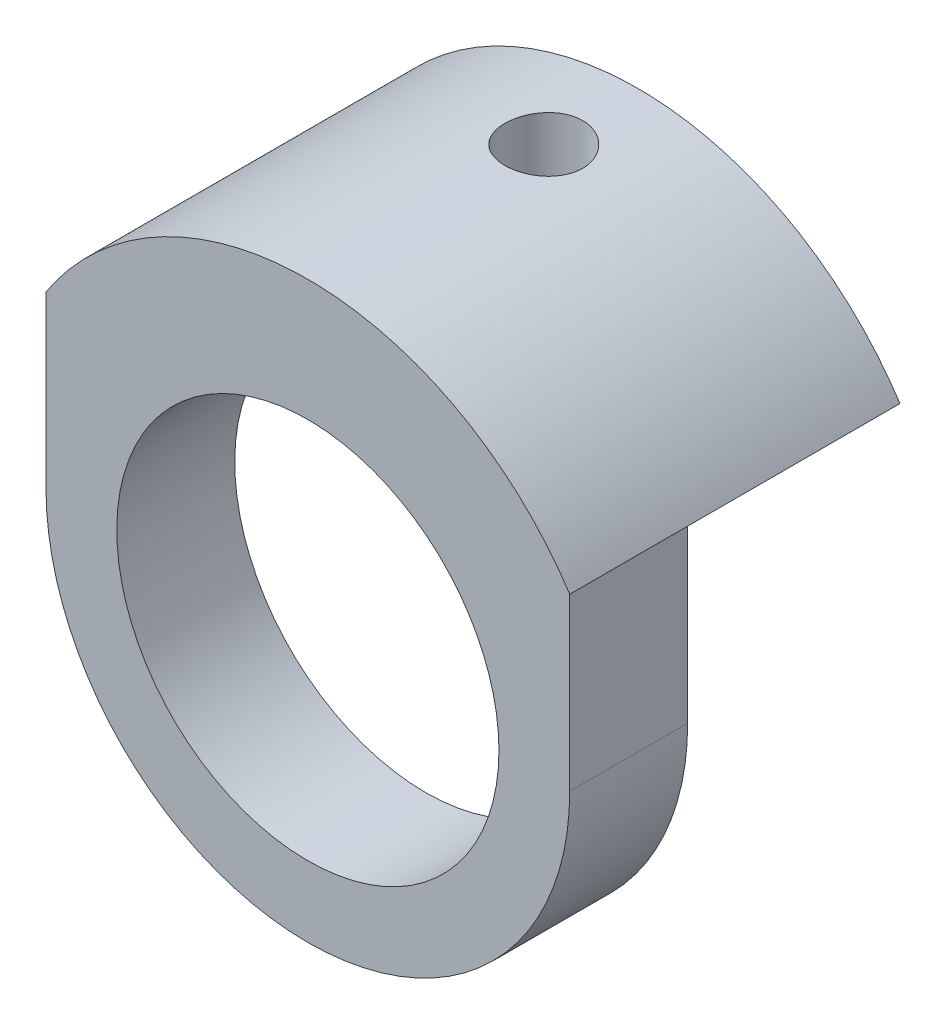
ISO-10303-21;
HEADER;
FILE_DESCRIPTION(('STEP AP214'),'2;1');
FILE_NAME('part.step','',(''),(''),'','','');
FILE_SCHEMA(('AUTOMOTIVE_DESIGN { 1 0 10303 214 1 1 1 1 }'));
ENDSEC;
DATA;
#1=APPLICATION_CONTEXT('core data for automotive mechanical design processes');
#2=APPLICATION_PROTOCOL_DEFINITION('international standard','automotive_design',2000,#1);
#3=PRODUCT_CONTEXT('',#1,'mechanical');
#4=PRODUCT('Part','Part','',(#3));
#5=PRODUCT_RELATED_PRODUCT_CATEGORY('part','',(#4));
#6=PRODUCT_DEFINITION_FORMATION('','',#4);
#7=PRODUCT_DEFINITION_CONTEXT('part definition',#1,'design');
#8=PRODUCT_DEFINITION('design','',#6,#7);
#9=PRODUCT_DEFINITION_SHAPE('','',#8);
#10=(LENGTH_UNIT() NAMED_UNIT(*) SI_UNIT(.MILLI.,.METRE.));
#11=(NAMED_UNIT(*) PLANE_ANGLE_UNIT() SI_UNIT($,.RADIAN.));
#12=(NAMED_UNIT(*) SI_UNIT($,.STERADIAN.) SOLID_ANGLE_UNIT());
#13=UNCERTAINTY_MEASURE_WITH_UNIT(LENGTH_MEASURE(1.E-05),#10,'distance_accuracy_value','');
#14=(GEOMETRIC_REPRESENTATION_CONTEXT(3) GLOBAL_UNCERTAINTY_ASSIGNED_CONTEXT((#13)) GLOBAL_UNIT_ASSIGNED_CONTEXT((#10,
#11,#12)) REPRESENTATION_CONTEXT('',''));
#15=CARTESIAN_POINT('',(0.,0.,0.));
#16=DIRECTION('',(0.,0.,1.));
#17=DIRECTION('',(1.,0.,0.));
#18=AXIS2_PLACEMENT_3D('',#15,#16,#17);
#19=CARTESIAN_POINT('',(0.,13.251,4.));
#20=DIRECTION('',(0.,-1.,0.));
#21=DIRECTION('',(1.,0.,0.));
#22=AXIS2_PLACEMENT_3D('',#19,#20,#21);
#23=CYLINDRICAL_SURFACE('',#22,1.65);
#24=CARTESIAN_POINT('',(1.65,13.1468627436358,4.));
#25=CARTESIAN_POINT('',(1.64999607435799,13.1468640650512,3.90770511397931));
#26=CARTESIAN_POINT('',(1.6422299195592,13.1478451438771,3.81535247378816));
#27=CARTESIAN_POINT('',(1.61137186955299,13.1516619895794,3.63321718129561));
#28=CARTESIAN_POINT('',(1.58826394124934,13.1544996967012,3.54343732020779));
#29=CARTESIAN_POINT('',(1.52741396738131,13.1617035092574,3.36911099002338));
#30=CARTESIAN_POINT('',(1.48968183191,13.16606857948,3.28456102178633));
#31=CARTESIAN_POINT('',(1.40067568217671,13.1758340367914,3.1230089356762));
#32=CARTESIAN_POINT('',(1.34940399073085,13.1812342462505,3.04600552623623));
#33=CARTESIAN_POINT('',(1.23446901262629,13.1924951124963,2.90128881872499));
#34=CARTESIAN_POINT('',(1.17074551032243,13.1983579207512,2.83362350644956));
#35=CARTESIAN_POINT('',(1.03284538397164,13.2098640409056,2.70991823609294));
#36=CARTESIAN_POINT('',(0.958668241082194,13.2155073418925,2.65387885537973));
#37=CARTESIAN_POINT('',(0.801665028730647,13.2259605973692,2.55484422047103));
#38=CARTESIAN_POINT('',(0.718811377428216,13.2307677565552,2.51189237261777));
#39=CARTESIAN_POINT('',(0.546997062063094,13.238983451133,2.44053006568299));
#40=CARTESIAN_POINT('',(0.458036623161723,13.2423920380587,2.4121190707968));
#41=CARTESIAN_POINT('',(0.277024619016617,13.2474113820262,2.37078826585331));
#42=CARTESIAN_POINT('',(0.184991525871498,13.2490313924342,2.35778869729456));
#43=CARTESIAN_POINT('',(3.68047326695237E-05,13.2503226471851,2.34740258034791));
#44=CARTESIAN_POINT('',(-0.0928847884134744,13.2499939676464,2.35001542211818));
#45=CARTESIAN_POINT('',(-0.276436179408862,13.2474323647979,2.37071601941107));
#46=CARTESIAN_POINT('',(-0.367075819209221,13.2452099970323,2.38871799666264));
#47=CARTESIAN_POINT('',(-0.54403743451124,13.2391225911245,2.43955177538381));
#48=CARTESIAN_POINT('',(-0.630359328419617,13.2352575219531,2.47238385698327));
#49=CARTESIAN_POINT('',(-0.796500742017656,13.226300830311,2.55203714028923));
#50=CARTESIAN_POINT('',(-0.876302274026038,13.2212059585983,2.59889548063553));
#51=CARTESIAN_POINT('',(-1.02694147117898,13.2103597016208,2.7052441286148));
#52=CARTESIAN_POINT('',(-1.09777872807075,13.2046082864783,2.76473501123131));
#53=CARTESIAN_POINT('',(-1.22898247318828,13.1930465836236,2.89514048417062));
#54=CARTESIAN_POINT('',(-1.28927467573931,13.1872361612017,2.96612982743988));
#55=CARTESIAN_POINT('',(-1.39709953623934,13.1762498298532,3.11726025053199));
#56=CARTESIAN_POINT('',(-1.44463215473402,13.1710739228887,3.19740135865222));
#57=CARTESIAN_POINT('',(-1.52559272769009,13.1619426941876,3.36462640626011));
#58=CARTESIAN_POINT('',(-1.55901475894807,13.1579878852183,3.45171324315707));
#59=CARTESIAN_POINT('',(-1.61073969410903,13.1517566350547,3.6303234093091));
#60=CARTESIAN_POINT('',(-1.62904332097041,13.1494801136056,3.72184652620074));
#61=CARTESIAN_POINT('',(-1.64991355176687,13.1468778434556,3.90607524167058));
#62=CARTESIAN_POINT('',(-1.65258468597965,13.1465391374459,3.99876882253803));
#63=CARTESIAN_POINT('',(-1.64238988675226,13.1478165797578,4.18328217323734));
#64=CARTESIAN_POINT('',(-1.62952428191931,13.1494326867343,4.27510196150882));
#65=CARTESIAN_POINT('',(-1.58870921193719,13.1544258366627,4.45494822167048));
#66=CARTESIAN_POINT('',(-1.56081033788897,13.157796972178,4.54298635307696));
#67=CARTESIAN_POINT('',(-1.49077274562441,13.1659155451461,4.71313493265466));
#68=CARTESIAN_POINT('',(-1.44863353067017,13.1706630306084,4.79524517392529));
#69=CARTESIAN_POINT('',(-1.35105432544892,13.18103042312,4.95168016534115));
#70=CARTESIAN_POINT('',(-1.29554577183661,13.1866547728599,5.02596184860754));
#71=CARTESIAN_POINT('',(-1.17290052421013,13.1981282068846,5.16419177239279));
#72=CARTESIAN_POINT('',(-1.10576338136759,13.2039772998371,5.2281396138724));
#73=CARTESIAN_POINT('',(-0.961310170116461,13.2152809597203,5.34425366842125));
#74=CARTESIAN_POINT('',(-0.883938682048181,13.2207331083226,5.39635120499879));
#75=CARTESIAN_POINT('',(-0.7214826767725,13.2305924211063,5.48681064627915));
#76=CARTESIAN_POINT('',(-0.636398314072024,13.2349996062145,5.52517282605715));
#77=CARTESIAN_POINT('',(-0.461160244382222,13.2422616815536,5.58695912399668));
#78=CARTESIAN_POINT('',(-0.371020722874638,13.2451206971071,5.61042297004472));
#79=CARTESIAN_POINT('',(-0.188043451286781,13.2489814248757,5.64187579379073));
#80=CARTESIAN_POINT('',(-0.095205822106026,13.2499832201812,5.64986546378929));
#81=CARTESIAN_POINT('',(0.0898616833820928,13.2500162480837,5.65013026764066));
#82=CARTESIAN_POINT('',(0.18209142371569,13.2490607617256,5.64251131306574));
#83=CARTESIAN_POINT('',(0.36394881870391,13.2453129816565,5.61199941109229));
#84=CARTESIAN_POINT('',(0.453576475073469,13.242520689156,5.5891064737605));
#85=CARTESIAN_POINT('',(0.627671893379549,13.2354116689791,5.52872962942634));
#86=CARTESIAN_POINT('',(0.712141423367617,13.2310954671329,5.49125075489577));
#87=CARTESIAN_POINT('',(0.873608853011816,13.2214166265186,5.40277689890748));
#88=CARTESIAN_POINT('',(0.950606666541092,13.2160539756904,5.35178176167239));
#89=CARTESIAN_POINT('',(1.09548610440228,13.2048374686287,5.23733096909175));
#90=CARTESIAN_POINT('',(1.1633052443145,13.1989806471307,5.17379650287248));
#91=CARTESIAN_POINT('',(1.2873609241998,13.187459721669,5.03623411467208));
#92=CARTESIAN_POINT('',(1.34359471613078,13.1817956636942,4.9622037100704));
#93=CARTESIAN_POINT('',(1.44306750417806,13.1712784220509,4.8054257245064));
#94=CARTESIAN_POINT('',(1.48625586556726,13.1664284296471,4.72264581856065));
#95=CARTESIAN_POINT('',(1.55805699764563,13.1581258730386,4.55099432728715));
#96=CARTESIAN_POINT('',(1.58668563327671,13.1546717886355,4.46212949274092));
#97=CARTESIAN_POINT('',(1.62169480569012,13.150391478048,4.31066987143917));
#98=CARTESIAN_POINT('',(1.6322940049525,13.1490747861617,4.24903071232529));
#99=CARTESIAN_POINT('',(1.6464479044481,13.1473099749323,4.12493652092024));
#100=CARTESIAN_POINT('',(1.65000265756848,13.1468618490683,4.06248149475784));
#101=CARTESIAN_POINT('',(1.65,13.1468627436358,4.));
#102=B_SPLINE_CURVE_WITH_KNOTS('',3,(#24,#25,#26,#27,#28,#29,#30,#31,#32,#33,#34,#35,#36,#37,
#38,#39,#40,#41,#42,#43,#44,#45,#46,#47,#48,#49,#50,#51,#52,#53,#54,#55,#56,#57,#58,#59,#60,#61,
#62,#63,#64,#65,#66,#67,#68,#69,#70,#71,#72,#73,#74,#75,#76,#77,#78,#79,#80,#81,#82,#83,#84,#85,
#86,#87,#88,#89,#90,#91,#92,#93,#94,#95,#96,#97,#98,#99,#100,#101),.UNSPECIFIED.,.T.,.F.,(4,2,2,
2,2,2,2,2,2,2,2,2,2,2,2,2,2,2,2,2,2,2,2,2,2,2,2,2,2,2,2,2,2,2,2,2,2,2,4),(0.,0.276656404162496,
0.553602387333798,0.830361025284306,1.10707221394927,1.38515623238741,1.66325405775312,
1.94226443200912,2.22126452448675,2.49881432004205,2.77635327419844,3.05235525227836,
3.32836244405236,3.60510700952187,3.88186417401463,4.16049866208137,4.43913401171284,
4.71788620813681,4.99662507392702,5.27349793894918,5.55036494812013,5.82630598982224,
6.10225665801612,6.37965382970264,6.65706171046748,6.93603847462928,7.21500965146826,
7.49323376472387,7.77144543019758,8.04777555735825,8.32410550239588,8.60034019187671,
8.87657806515064,9.15461083017709,9.43270946877897,9.71187404898365,9.99073378344408,
10.1780251512489,10.3653151129325),.UNSPECIFIED.);
#103=CARTESIAN_POINT('',(1.65,13.1468627436358,4.));
#104=VERTEX_POINT('',#103);
#105=EDGE_CURVE('E147',#104,#104,#102,.T.);
#106=ORIENTED_EDGE('',*,*,#105,.T.);
#107=EDGE_LOOP('',(#106));
#108=FACE_BOUND('',#107,.T.);
#109=CARTESIAN_POINT('',(0.,10.2355027468725,4.));
#110=DIRECTION('',(0.,-1.,0.));
#111=DIRECTION('',(0.,0.,-1.));
#112=AXIS2_PLACEMENT_3D('',#109,#110,#111);
#113=CIRCLE('',#112,1.65);
#114=CARTESIAN_POINT('',(0.,10.2355027468725,2.35));
#115=VERTEX_POINT('',#114);
#116=EDGE_CURVE('E144',#115,#115,#113,.F.);
#117=ORIENTED_EDGE('',*,*,#116,.F.);
#118=EDGE_LOOP('',(#117));
#119=FACE_BOUND('',#118,.T.);
#120=ADVANCED_FACE('F45',(#108,#119),#23,.F.);
#121=CARTESIAN_POINT('',(0.,0.,14.));
#122=DIRECTION('',(0.,0.,-1.));
#123=DIRECTION('',(-1.,0.,0.));
#124=AXIS2_PLACEMENT_3D('',#121,#122,#123);
#125=CYLINDRICAL_SURFACE('',#124,11.1);
#126=CARTESIAN_POINT('',(0.,0.,9.));
#127=DIRECTION('',(0.,0.,1.));
#128=DIRECTION('',(0.,-1.,0.));
#129=AXIS2_PLACEMENT_3D('',#126,#127,#128);
#130=CIRCLE('',#129,11.1);
#131=CARTESIAN_POINT('',(-11.1,0.,9.));
#132=VERTEX_POINT('',#131);
#133=CARTESIAN_POINT('',(11.1,0.,9.));
#134=VERTEX_POINT('',#133);
#135=EDGE_CURVE('E135',#132,#134,#130,.T.);
#136=ORIENTED_EDGE('',*,*,#135,.T.);
#137=DIRECTION('',(0.,0.,-1.));
#138=VECTOR('',#137,1.);
#139=CARTESIAN_POINT('',(11.1,0.,14.));
#140=LINE('',#139,#138);
#141=CARTESIAN_POINT('',(11.1,0.,14.));
#142=VERTEX_POINT('',#141);
#143=EDGE_CURVE('E120',#142,#134,#140,.T.);
#144=ORIENTED_EDGE('',*,*,#143,.F.);
#145=CARTESIAN_POINT('',(0.,0.,14.));
#146=DIRECTION('',(0.,0.,1.));
#147=DIRECTION('',(1.,0.,0.));
#148=AXIS2_PLACEMENT_3D('',#145,#146,#147);
#149=CIRCLE('',#148,11.1);
#150=CARTESIAN_POINT('',(-11.1,0.,14.));
#151=VERTEX_POINT('',#150);
#152=EDGE_CURVE('E106',#151,#142,#149,.T.);
#153=ORIENTED_EDGE('',*,*,#152,.F.);
#154=DIRECTION('',(0.,0.,-1.));
#155=VECTOR('',#154,1.);
#156=CARTESIAN_POINT('',(-11.1,0.,14.));
#157=LINE('',#156,#155);
#158=EDGE_CURVE('E68',#151,#132,#157,.T.);
#159=ORIENTED_EDGE('',*,*,#158,.T.);
#160=EDGE_LOOP('',(#136,#144,#153,#159));
#161=FACE_BOUND('',#160,.T.);
#162=ADVANCED_FACE('F247',(#161),#125,.T.);
#163=CARTESIAN_POINT('',(11.1,0.,14.));
#164=DIRECTION('',(-1.,0.,0.));
#165=DIRECTION('',(0.,-1.,0.));
#166=AXIS2_PLACEMENT_3D('',#163,#164,#165);
#167=PLANE('',#166);
#168=ORIENTED_EDGE('',*,*,#143,.T.);
#169=DIRECTION('',(0.,-1.,0.));
#170=VECTOR('',#169,1.);
#171=CARTESIAN_POINT('',(11.1,7.23550274687255,9.));
#172=LINE('',#171,#170);
#173=CARTESIAN_POINT('',(11.1,7.23550274687254,9.));
#174=VERTEX_POINT('',#173);
#175=EDGE_CURVE('E117',#174,#134,#172,.T.);
#176=ORIENTED_EDGE('',*,*,#175,.F.);
#177=DIRECTION('',(0.,0.,-1.));
#178=VECTOR('',#177,1.);
#179=CARTESIAN_POINT('',(11.1,7.23550274687253,14.));
#180=LINE('',#179,#178);
#181=CARTESIAN_POINT('',(11.1,7.23550274687253,14.));
#182=VERTEX_POINT('',#181);
#183=EDGE_CURVE('E113',#182,#174,#180,.T.);
#184=ORIENTED_EDGE('',*,*,#183,.F.);
#185=DIRECTION('',(0.,1.,0.));
#186=VECTOR('',#185,1.);
#187=CARTESIAN_POINT('',(11.1,0.,14.));
#188=LINE('',#187,#186);
#189=EDGE_CURVE('E99',#142,#182,#188,.T.);
#190=ORIENTED_EDGE('',*,*,#189,.F.);
#191=EDGE_LOOP('',(#168,#176,#184,#190));
#192=FACE_BOUND('',#191,.T.);
#193=ADVANCED_FACE('F114',(#192),#167,.F.);
#194=CARTESIAN_POINT('',(0.,0.,14.));
#195=DIRECTION('',(0.,0.,-1.));
#196=DIRECTION('',(-1.,0.,0.));
#197=AXIS2_PLACEMENT_3D('',#194,#195,#196);
#198=CYLINDRICAL_SURFACE('',#197,13.25);
#199=ORIENTED_EDGE('',*,*,#105,.F.);
#200=EDGE_LOOP('',(#199));
#201=FACE_BOUND('',#200,.T.);
#202=CARTESIAN_POINT('',(0.,0.,0.));
#203=DIRECTION('',(0.,0.,1.));
#204=DIRECTION('',(1.,0.,0.));
#205=AXIS2_PLACEMENT_3D('',#202,#203,#204);
#206=CIRCLE('',#205,13.25);
#207=CARTESIAN_POINT('',(11.1,7.23550274687254,0.));
#208=VERTEX_POINT('',#207);
#209=CARTESIAN_POINT('',(-11.1,7.23550274687253,0.));
#210=VERTEX_POINT('',#209);
#211=EDGE_CURVE('E134',#208,#210,#206,.T.);
#212=ORIENTED_EDGE('',*,*,#211,.T.);
#213=DIRECTION('',(0.,0.,-1.));
#214=VECTOR('',#213,1.);
#215=CARTESIAN_POINT('',(-11.1,7.23550274687253,0.));
#216=LINE('',#215,#214);
#217=CARTESIAN_POINT('',(-11.1,7.23550274687253,9.));
#218=VERTEX_POINT('',#217);
#219=EDGE_CURVE('E82',#218,#210,#216,.T.);
#220=ORIENTED_EDGE('',*,*,#219,.F.);
#221=DIRECTION('',(0.,0.,-1.));
#222=VECTOR('',#221,1.);
#223=CARTESIAN_POINT('',(-11.1,7.23550274687253,14.));
#224=LINE('',#223,#222);
#225=CARTESIAN_POINT('',(-11.1,7.23550274687253,14.));
#226=VERTEX_POINT('',#225);
#227=EDGE_CURVE('E121',#226,#218,#224,.T.);
#228=ORIENTED_EDGE('',*,*,#227,.F.);
#229=CARTESIAN_POINT('',(0.,0.,14.));
#230=DIRECTION('',(0.,0.,1.));
#231=DIRECTION('',(1.,0.,0.));
#232=AXIS2_PLACEMENT_3D('',#229,#230,#231);
#233=CIRCLE('',#232,13.25);
#234=EDGE_CURVE('E104',#182,#226,#233,.T.);
#235=ORIENTED_EDGE('',*,*,#234,.F.);
#236=ORIENTED_EDGE('',*,*,#183,.T.);
#237=DIRECTION('',(0.,0.,1.));
#238=VECTOR('',#237,1.);
#239=CARTESIAN_POINT('',(11.1,7.23550274687254,0.));
#240=LINE('',#239,#238);
#241=EDGE_CURVE('E265',#208,#174,#240,.T.);
#242=ORIENTED_EDGE('',*,*,#241,.F.);
#243=EDGE_LOOP('',(#212,#220,#228,#235,#236,#242));
#244=FACE_BOUND('',#243,.T.);
#245=ADVANCED_FACE('F124',(#201,#244),#198,.T.);
#246=CARTESIAN_POINT('',(0.,0.,14.));
#247=DIRECTION('',(0.,0.,-1.));
#248=DIRECTION('',(-1.,0.,0.));
#249=AXIS2_PLACEMENT_3D('',#246,#247,#248);
#250=CYLINDRICAL_SURFACE('',#249,8.1);
#251=CARTESIAN_POINT('',(0.,0.,9.59999999999999));
#252=DIRECTION('',(0.866025403784439,0.,0.5));
#253=DIRECTION('',(0.5,0.,-0.866025403784439));
#254=AXIS2_PLACEMENT_3D('',#251,#252,#253);
#255=ELLIPSE('',#254,16.2,8.1);
#256=CARTESIAN_POINT('',(3.2331615074619,7.42675344054633,4.));
#257=VERTEX_POINT('',#256);
#258=CARTESIAN_POINT('',(1.61658075373095,7.9370439501534,6.8));
#259=VERTEX_POINT('',#258);
#260=EDGE_CURVE('E11',#257,#259,#255,.T.);
#261=ORIENTED_EDGE('',*,*,#260,.F.);
#262=CARTESIAN_POINT('',(0.,0.,-1.6));
#263=DIRECTION('',(0.866025403784439,0.,-0.5));
#264=DIRECTION('',(-0.5,0.,-0.866025403784439));
#265=AXIS2_PLACEMENT_3D('',#262,#263,#264);
#266=ELLIPSE('',#265,16.2,8.1);
#267=CARTESIAN_POINT('',(1.61658075373095,7.9370439501534,1.2));
#268=VERTEX_POINT('',#267);
#269=EDGE_CURVE('E53',#268,#257,#266,.T.);
#270=ORIENTED_EDGE('',*,*,#269,.F.);
#271=CARTESIAN_POINT('',(0.,0.,1.2));
#272=DIRECTION('',(0.,0.,-1.));
#273=DIRECTION('',(-1.,0.,0.));
#274=AXIS2_PLACEMENT_3D('',#271,#272,#273);
#275=CIRCLE('',#274,8.1);
#276=CARTESIAN_POINT('',(-1.61658075373095,7.9370439501534,1.2));
#277=VERTEX_POINT('',#276);
#278=EDGE_CURVE('E156',#277,#268,#275,.T.);
#279=ORIENTED_EDGE('',*,*,#278,.F.);
#280=CARTESIAN_POINT('',(0.,0.,-1.6));
#281=DIRECTION('',(-0.866025403784439,0.,-0.5));
#282=DIRECTION('',(0.5,0.,-0.866025403784439));
#283=AXIS2_PLACEMENT_3D('',#280,#281,#282);
#284=ELLIPSE('',#283,16.2,8.1);
#285=CARTESIAN_POINT('',(-3.2331615074619,7.42675344054632,4.));
#286=VERTEX_POINT('',#285);
#287=EDGE_CURVE('E153',#286,#277,#284,.T.);
#288=ORIENTED_EDGE('',*,*,#287,.F.);
#289=CARTESIAN_POINT('',(0.,0.,9.60000000000001));
#290=DIRECTION('',(-0.866025403784439,0.,0.499999999999999));
#291=DIRECTION('',(-0.499999999999999,0.,-0.866025403784439));
#292=AXIS2_PLACEMENT_3D('',#289,#290,#291);
#293=ELLIPSE('',#292,16.2,8.1);
#294=CARTESIAN_POINT('',(-1.61658075373095,7.9370439501534,6.8));
#295=VERTEX_POINT('',#294);
#296=EDGE_CURVE('E150',#295,#286,#293,.T.);
#297=ORIENTED_EDGE('',*,*,#296,.F.);
#298=CARTESIAN_POINT('',(0.,0.,6.8));
#299=DIRECTION('',(0.,0.,1.));
#300=DIRECTION('',(1.,0.,0.));
#301=AXIS2_PLACEMENT_3D('',#298,#299,#300);
#302=CIRCLE('',#301,8.1);
#303=EDGE_CURVE('E143',#259,#295,#302,.T.);
#304=ORIENTED_EDGE('',*,*,#303,.F.);
#305=EDGE_LOOP('',(#261,#270,#279,#288,#297,#304));
#306=FACE_BOUND('',#305,.T.);
#307=DIRECTION('',(0.,0.,-1.));
#308=VECTOR('',#307,1.);
#309=CARTESIAN_POINT('',(3.6410850031275,7.23550274687254,14.));
#310=LINE('',#309,#308);
#311=CARTESIAN_POINT('',(3.6410850031275,7.23550274687254,9.));
#312=VERTEX_POINT('',#311);
#313=CARTESIAN_POINT('',(3.6410850031275,7.23550274687254,0.));
#314=VERTEX_POINT('',#313);
#315=EDGE_CURVE('E280',#312,#314,#310,.T.);
#316=ORIENTED_EDGE('',*,*,#315,.F.);
#317=CARTESIAN_POINT('',(0.,0.,9.));
#318=DIRECTION('',(0.,0.,1.));
#319=DIRECTION('',(0.,-1.,0.));
#320=AXIS2_PLACEMENT_3D('',#317,#318,#319);
#321=CIRCLE('',#320,8.1);
#322=CARTESIAN_POINT('',(-3.6410850031275,7.23550274687254,9.));
#323=VERTEX_POINT('',#322);
#324=EDGE_CURVE('E260',#323,#312,#321,.T.);
#325=ORIENTED_EDGE('',*,*,#324,.F.);
#326=DIRECTION('',(0.,0.,-1.));
#327=VECTOR('',#326,1.);
#328=CARTESIAN_POINT('',(-3.6410850031275,7.23550274687254,14.));
#329=LINE('',#328,#327);
#330=CARTESIAN_POINT('',(-3.6410850031275,7.23550274687254,0.));
#331=VERTEX_POINT('',#330);
#332=EDGE_CURVE('E90',#331,#323,#329,.F.);
#333=ORIENTED_EDGE('',*,*,#332,.F.);
#334=CARTESIAN_POINT('',(0.,0.,0.));
#335=DIRECTION('',(0.,0.,1.));
#336=DIRECTION('',(1.,0.,0.));
#337=AXIS2_PLACEMENT_3D('',#334,#335,#336);
#338=CIRCLE('',#337,8.1);
#339=EDGE_CURVE('E131',#314,#331,#338,.T.);
#340=ORIENTED_EDGE('',*,*,#339,.F.);
#341=EDGE_LOOP('',(#316,#325,#333,#340));
#342=FACE_BOUND('',#341,.T.);
#343=CARTESIAN_POINT('',(0.,0.,14.));
#344=DIRECTION('',(0.,0.,1.));
#345=DIRECTION('',(1.,0.,0.));
#346=AXIS2_PLACEMENT_3D('',#343,#344,#345);
#347=CIRCLE('',#346,8.1);
#348=CARTESIAN_POINT('',(8.1,0.,14.));
#349=VERTEX_POINT('',#348);
#350=EDGE_CURVE('E137',#349,#349,#347,.T.);
#351=ORIENTED_EDGE('',*,*,#350,.T.);
#352=EDGE_LOOP('',(#351));
#353=FACE_BOUND('',#352,.T.);
#354=ADVANCED_FACE('F47',(#306,#342,#353),#250,.F.);
#355=CARTESIAN_POINT('',(-11.1,0.,14.));
#356=DIRECTION('',(-1.,0.,0.));
#357=DIRECTION('',(0.,-1.,0.));
#358=AXIS2_PLACEMENT_3D('',#355,#356,#357);
#359=PLANE('',#358);
#360=DIRECTION('',(0.,1.,0.));
#361=VECTOR('',#360,1.);
#362=CARTESIAN_POINT('',(-11.1,7.23550274687253,9.));
#363=LINE('',#362,#361);
#364=EDGE_CURVE('E218',#132,#218,#363,.T.);
#365=ORIENTED_EDGE('',*,*,#364,.F.);
#366=ORIENTED_EDGE('',*,*,#158,.F.);
#367=DIRECTION('',(0.,1.,0.));
#368=VECTOR('',#367,1.);
#369=CARTESIAN_POINT('',(-11.1,0.,14.));
#370=LINE('',#369,#368);
#371=EDGE_CURVE('E126',#151,#226,#370,.T.);
#372=ORIENTED_EDGE('',*,*,#371,.T.);
#373=ORIENTED_EDGE('',*,*,#227,.T.);
#374=EDGE_LOOP('',(#365,#366,#372,#373));
#375=FACE_BOUND('',#374,.T.);
#376=ADVANCED_FACE('F236',(#375),#359,.T.);
#377=CARTESIAN_POINT('',(0.,0.,14.));
#378=DIRECTION('',(0.,0.,1.));
#379=DIRECTION('',(1.,0.,0.));
#380=AXIS2_PLACEMENT_3D('',#377,#378,#379);
#381=PLANE('',#380);
#382=ORIENTED_EDGE('',*,*,#350,.F.);
#383=EDGE_LOOP('',(#382));
#384=FACE_BOUND('',#383,.T.);
#385=ORIENTED_EDGE('',*,*,#152,.T.);
#386=ORIENTED_EDGE('',*,*,#189,.T.);
#387=ORIENTED_EDGE('',*,*,#234,.T.);
#388=ORIENTED_EDGE('',*,*,#371,.F.);
#389=EDGE_LOOP('',(#385,#386,#387,#388));
#390=FACE_BOUND('',#389,.T.);
#391=ADVANCED_FACE('F101',(#384,#390),#381,.T.);
#392=CARTESIAN_POINT('',(0.,0.,0.));
#393=DIRECTION('',(0.,0.,1.));
#394=DIRECTION('',(1.,0.,0.));
#395=AXIS2_PLACEMENT_3D('',#392,#393,#394);
#396=PLANE('',#395);
#397=ORIENTED_EDGE('',*,*,#211,.F.);
#398=DIRECTION('',(-1.,0.,0.));
#399=VECTOR('',#398,1.);
#400=CARTESIAN_POINT('',(31.5252456773614,7.23550274687254,0.));
#401=LINE('',#400,#399);
#402=EDGE_CURVE('E266',#208,#314,#401,.T.);
#403=ORIENTED_EDGE('',*,*,#402,.T.);
#404=ORIENTED_EDGE('',*,*,#339,.T.);
#405=DIRECTION('',(-1.,0.,0.));
#406=VECTOR('',#405,1.);
#407=CARTESIAN_POINT('',(0.,7.23550274687254,0.));
#408=LINE('',#407,#406);
#409=EDGE_CURVE('E141',#331,#210,#408,.T.);
#410=ORIENTED_EDGE('',*,*,#409,.T.);
#411=EDGE_LOOP('',(#397,#403,#404,#410));
#412=FACE_BOUND('',#411,.T.);
#413=ADVANCED_FACE('F232',(#412),#396,.F.);
#414=CARTESIAN_POINT('',(31.5252456773614,7.23550274687254,9.));
#415=DIRECTION('',(0.,0.,1.));
#416=DIRECTION('',(0.,-1.,0.));
#417=AXIS2_PLACEMENT_3D('',#414,#415,#416);
#418=PLANE('',#417);
#419=ORIENTED_EDGE('',*,*,#135,.F.);
#420=ORIENTED_EDGE('',*,*,#364,.T.);
#421=DIRECTION('',(-1.,0.,0.));
#422=VECTOR('',#421,1.);
#423=CARTESIAN_POINT('',(31.5252456773614,7.23550274687254,9.));
#424=LINE('',#423,#422);
#425=EDGE_CURVE('E274',#323,#218,#424,.T.);
#426=ORIENTED_EDGE('',*,*,#425,.F.);
#427=ORIENTED_EDGE('',*,*,#324,.T.);
#428=EDGE_CURVE('E264',#174,#312,#424,.T.);
#429=ORIENTED_EDGE('',*,*,#428,.F.);
#430=ORIENTED_EDGE('',*,*,#175,.T.);
#431=EDGE_LOOP('',(#419,#420,#426,#427,#429,#430));
#432=FACE_BOUND('',#431,.T.);
#433=ADVANCED_FACE('F229',(#432),#418,.F.);
#434=CARTESIAN_POINT('',(31.5252456773614,7.23550274687254,0.));
#435=DIRECTION('',(0.,1.,0.));
#436=DIRECTION('',(-1.,0.,0.));
#437=AXIS2_PLACEMENT_3D('',#434,#435,#436);
#438=PLANE('',#437);
#439=ORIENTED_EDGE('',*,*,#315,.T.);
#440=ORIENTED_EDGE('',*,*,#402,.F.);
#441=ORIENTED_EDGE('',*,*,#241,.T.);
#442=ORIENTED_EDGE('',*,*,#428,.T.);
#443=EDGE_LOOP('',(#439,#440,#441,#442));
#444=FACE_BOUND('',#443,.T.);
#445=ADVANCED_FACE('F228',(#444),#438,.F.);
#446=ORIENTED_EDGE('',*,*,#332,.T.);
#447=ORIENTED_EDGE('',*,*,#425,.T.);
#448=ORIENTED_EDGE('',*,*,#219,.T.);
#449=ORIENTED_EDGE('',*,*,#409,.F.);
#450=EDGE_LOOP('',(#446,#447,#448,#449));
#451=FACE_BOUND('',#450,.T.);
#452=ADVANCED_FACE('F224',(#451),#438,.F.);
#453=CARTESIAN_POINT('',(0.,10.2355027468725,0.));
#454=DIRECTION('',(0.,-1.,0.));
#455=DIRECTION('',(0.,0.,-1.));
#456=AXIS2_PLACEMENT_3D('',#453,#454,#455);
#457=PLANE('',#456);
#458=DIRECTION('',(-0.5,0.,0.866025403784438));
#459=VECTOR('',#458,1.);
#460=CARTESIAN_POINT('',(3.2331615074619,10.2355027468725,4.));
#461=LINE('',#460,#459);
#462=CARTESIAN_POINT('',(3.2331615074619,10.2355027468725,4.));
#463=VERTEX_POINT('',#462);
#464=CARTESIAN_POINT('',(1.61658075373095,10.2355027468725,6.8));
#465=VERTEX_POINT('',#464);
#466=EDGE_CURVE('E181',#463,#465,#461,.T.);
#467=ORIENTED_EDGE('',*,*,#466,.T.);
#468=DIRECTION('',(-1.,0.,0.));
#469=VECTOR('',#468,1.);
#470=CARTESIAN_POINT('',(1.61658075373095,10.2355027468725,6.8));
#471=LINE('',#470,#469);
#472=CARTESIAN_POINT('',(-1.61658075373096,10.2355027468725,6.8));
#473=VERTEX_POINT('',#472);
#474=EDGE_CURVE('E455',#465,#473,#471,.T.);
#475=ORIENTED_EDGE('',*,*,#474,.T.);
#476=DIRECTION('',(-0.499999999999999,0.,-0.866025403784439));
#477=VECTOR('',#476,1.);
#478=CARTESIAN_POINT('',(-1.61658075373096,10.2355027468725,6.8));
#479=LINE('',#478,#477);
#480=CARTESIAN_POINT('',(-3.23316150746191,10.2355027468725,4.));
#481=VERTEX_POINT('',#480);
#482=EDGE_CURVE('E201',#473,#481,#479,.T.);
#483=ORIENTED_EDGE('',*,*,#482,.T.);
#484=DIRECTION('',(0.5,0.,-0.866025403784438));
#485=VECTOR('',#484,1.);
#486=CARTESIAN_POINT('',(-3.23316150746191,10.2355027468725,4.));
#487=LINE('',#486,#485);
#488=CARTESIAN_POINT('',(-1.61658075373095,10.2355027468725,1.2));
#489=VERTEX_POINT('',#488);
#490=EDGE_CURVE('E462',#481,#489,#487,.T.);
#491=ORIENTED_EDGE('',*,*,#490,.T.);
#492=DIRECTION('',(1.,0.,0.));
#493=VECTOR('',#492,1.);
#494=CARTESIAN_POINT('',(-1.61658075373095,10.2355027468725,1.2));
#495=LINE('',#494,#493);
#496=CARTESIAN_POINT('',(1.61658075373095,10.2355027468725,1.2));
#497=VERTEX_POINT('',#496);
#498=EDGE_CURVE('E465',#489,#497,#495,.T.);
#499=ORIENTED_EDGE('',*,*,#498,.T.);
#500=DIRECTION('',(0.5,0.,0.866025403784439));
#501=VECTOR('',#500,1.);
#502=CARTESIAN_POINT('',(1.61658075373095,10.2355027468725,1.2));
#503=LINE('',#502,#501);
#504=EDGE_CURVE('E207',#497,#463,#503,.T.);
#505=ORIENTED_EDGE('',*,*,#504,.T.);
#506=EDGE_LOOP('',(#467,#475,#483,#491,#499,#505));
#507=FACE_BOUND('',#506,.T.);
#508=ORIENTED_EDGE('',*,*,#116,.T.);
#509=EDGE_LOOP('',(#508));
#510=FACE_BOUND('',#509,.T.);
#511=ADVANCED_FACE('F227',(#507,#510),#457,.T.);
#512=CARTESIAN_POINT('',(3.2331615074619,10.2355027468725,4.));
#513=DIRECTION('',(0.866025403784439,0.,0.5));
#514=DIRECTION('',(0.5,0.,-0.866025403784439));
#515=AXIS2_PLACEMENT_3D('',#512,#513,#514);
#516=PLANE('',#515);
#517=ORIENTED_EDGE('',*,*,#260,.T.);
#518=DIRECTION('',(0.,-1.,0.));
#519=VECTOR('',#518,1.);
#520=CARTESIAN_POINT('',(1.61658075373095,10.2355027468725,6.8));
#521=LINE('',#520,#519);
#522=EDGE_CURVE('E60',#465,#259,#521,.T.);
#523=ORIENTED_EDGE('',*,*,#522,.F.);
#524=ORIENTED_EDGE('',*,*,#466,.F.);
#525=DIRECTION('',(0.,-1.,0.));
#526=VECTOR('',#525,1.);
#527=CARTESIAN_POINT('',(3.2331615074619,10.2355027468725,4.));
#528=LINE('',#527,#526);
#529=EDGE_CURVE('E148',#463,#257,#528,.T.);
#530=ORIENTED_EDGE('',*,*,#529,.T.);
#531=EDGE_LOOP('',(#517,#523,#524,#530));
#532=FACE_BOUND('',#531,.T.);
#533=ADVANCED_FACE('F178',(#532),#516,.F.);
#534=CARTESIAN_POINT('',(1.61658075373095,10.2355027468725,1.2));
#535=DIRECTION('',(0.866025403784439,0.,-0.5));
#536=DIRECTION('',(-0.5,0.,-0.866025403784439));
#537=AXIS2_PLACEMENT_3D('',#534,#535,#536);
#538=PLANE('',#537);
#539=ORIENTED_EDGE('',*,*,#269,.T.);
#540=ORIENTED_EDGE('',*,*,#529,.F.);
#541=ORIENTED_EDGE('',*,*,#504,.F.);
#542=DIRECTION('',(0.,-1.,0.));
#543=VECTOR('',#542,1.);
#544=CARTESIAN_POINT('',(1.61658075373095,10.2355027468725,1.2));
#545=LINE('',#544,#543);
#546=EDGE_CURVE('E171',#497,#268,#545,.T.);
#547=ORIENTED_EDGE('',*,*,#546,.T.);
#548=EDGE_LOOP('',(#539,#540,#541,#547));
#549=FACE_BOUND('',#548,.T.);
#550=ADVANCED_FACE('F165',(#549),#538,.F.);
#551=CARTESIAN_POINT('',(-1.61658075373095,10.2355027468725,1.2));
#552=DIRECTION('',(0.,0.,-1.));
#553=DIRECTION('',(-1.,0.,0.));
#554=AXIS2_PLACEMENT_3D('',#551,#552,#553);
#555=PLANE('',#554);
#556=ORIENTED_EDGE('',*,*,#278,.T.);
#557=ORIENTED_EDGE('',*,*,#546,.F.);
#558=ORIENTED_EDGE('',*,*,#498,.F.);
#559=DIRECTION('',(0.,-1.,0.));
#560=VECTOR('',#559,1.);
#561=CARTESIAN_POINT('',(-1.61658075373095,10.2355027468725,1.2));
#562=LINE('',#561,#560);
#563=EDGE_CURVE('E205',#489,#277,#562,.T.);
#564=ORIENTED_EDGE('',*,*,#563,.T.);
#565=EDGE_LOOP('',(#556,#557,#558,#564));
#566=FACE_BOUND('',#565,.T.);
#567=ADVANCED_FACE('F316',(#566),#555,.F.);
#568=CARTESIAN_POINT('',(-3.23316150746191,10.2355027468725,4.));
#569=DIRECTION('',(-0.866025403784439,0.,-0.5));
#570=DIRECTION('',(-0.5,0.,0.866025403784439));
#571=AXIS2_PLACEMENT_3D('',#568,#569,#570);
#572=PLANE('',#571);
#573=ORIENTED_EDGE('',*,*,#287,.T.);
#574=ORIENTED_EDGE('',*,*,#563,.F.);
#575=ORIENTED_EDGE('',*,*,#490,.F.);
#576=DIRECTION('',(0.,-1.,0.));
#577=VECTOR('',#576,1.);
#578=CARTESIAN_POINT('',(-3.23316150746191,10.2355027468725,4.));
#579=LINE('',#578,#577);
#580=EDGE_CURVE('E203',#481,#286,#579,.T.);
#581=ORIENTED_EDGE('',*,*,#580,.T.);
#582=EDGE_LOOP('',(#573,#574,#575,#581));
#583=FACE_BOUND('',#582,.T.);
#584=ADVANCED_FACE('F324',(#583),#572,.F.);
#585=CARTESIAN_POINT('',(-1.61658075373096,10.2355027468725,6.8));
#586=DIRECTION('',(-0.866025403784439,0.,0.499999999999999));
#587=DIRECTION('',(0.499999999999999,0.,0.866025403784439));
#588=AXIS2_PLACEMENT_3D('',#585,#586,#587);
#589=PLANE('',#588);
#590=ORIENTED_EDGE('',*,*,#296,.T.);
#591=ORIENTED_EDGE('',*,*,#580,.F.);
#592=ORIENTED_EDGE('',*,*,#482,.F.);
#593=DIRECTION('',(0.,-1.,0.));
#594=VECTOR('',#593,1.);
#595=CARTESIAN_POINT('',(-1.61658075373096,10.2355027468725,6.8));
#596=LINE('',#595,#594);
#597=EDGE_CURVE('E192',#473,#295,#596,.T.);
#598=ORIENTED_EDGE('',*,*,#597,.T.);
#599=EDGE_LOOP('',(#590,#591,#592,#598));
#600=FACE_BOUND('',#599,.T.);
#601=ADVANCED_FACE('F197',(#600),#589,.F.);
#602=CARTESIAN_POINT('',(1.61658075373095,10.2355027468725,6.8));
#603=DIRECTION('',(0.,0.,1.));
#604=DIRECTION('',(1.,0.,0.));
#605=AXIS2_PLACEMENT_3D('',#602,#603,#604);
#606=PLANE('',#605);
#607=ORIENTED_EDGE('',*,*,#303,.T.);
#608=ORIENTED_EDGE('',*,*,#597,.F.);
#609=ORIENTED_EDGE('',*,*,#474,.F.);
#610=ORIENTED_EDGE('',*,*,#522,.T.);
#611=EDGE_LOOP('',(#607,#608,#609,#610));
#612=FACE_BOUND('',#611,.T.);
#613=ADVANCED_FACE('F190',(#612),#606,.F.);
#614=CLOSED_SHELL('',(#120,#162,#193,#245,#354,#376,#391,#413,#433,#445,#452,#511,#533,#550,
#567,#584,#601,#613));
#615=MANIFOLD_SOLID_BREP('B2',#614);
#616=ADVANCED_BREP_SHAPE_REPRESENTATION('',(#18,#615),#14);
#617=SHAPE_DEFINITION_REPRESENTATION(#9,#616);
ENDSEC;
END-ISO-10303-21;
